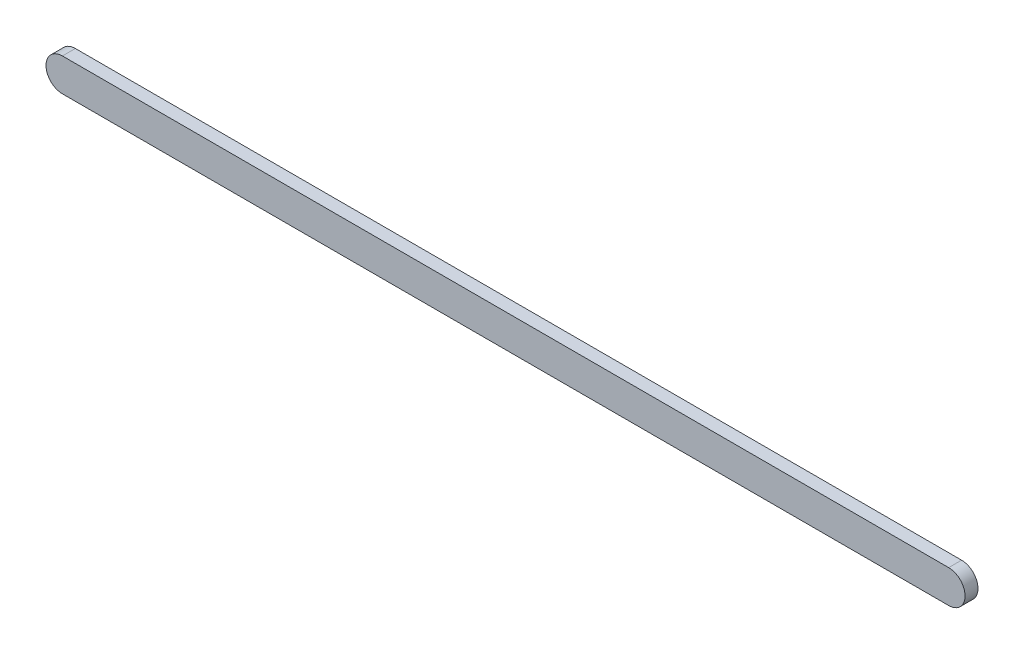
ISO-10303-21;
HEADER;
FILE_DESCRIPTION(('STEP AP214'),'2;1');
FILE_NAME('part.step','',(''),(''),'','','');
FILE_SCHEMA(('AUTOMOTIVE_DESIGN { 1 0 10303 214 1 1 1 1 }'));
ENDSEC;
DATA;
#1=APPLICATION_CONTEXT('core data for automotive mechanical design processes');
#2=APPLICATION_PROTOCOL_DEFINITION('international standard','automotive_design',2000,#1);
#3=PRODUCT_CONTEXT('',#1,'mechanical');
#4=PRODUCT('Part','Part','',(#3));
#5=PRODUCT_RELATED_PRODUCT_CATEGORY('part','',(#4));
#6=PRODUCT_DEFINITION_FORMATION('','',#4);
#7=PRODUCT_DEFINITION_CONTEXT('part definition',#1,'design');
#8=PRODUCT_DEFINITION('design','',#6,#7);
#9=PRODUCT_DEFINITION_SHAPE('','',#8);
#10=(LENGTH_UNIT() NAMED_UNIT(*) SI_UNIT(.MILLI.,.METRE.));
#11=(NAMED_UNIT(*) PLANE_ANGLE_UNIT() SI_UNIT($,.RADIAN.));
#12=(NAMED_UNIT(*) SI_UNIT($,.STERADIAN.) SOLID_ANGLE_UNIT());
#13=UNCERTAINTY_MEASURE_WITH_UNIT(LENGTH_MEASURE(1.E-05),#10,'distance_accuracy_value','');
#14=(GEOMETRIC_REPRESENTATION_CONTEXT(3) GLOBAL_UNCERTAINTY_ASSIGNED_CONTEXT((#13)) GLOBAL_UNIT_ASSIGNED_CONTEXT((#10,
#11,#12)) REPRESENTATION_CONTEXT('',''));
#15=CARTESIAN_POINT('',(0.,0.,0.));
#16=DIRECTION('',(0.,0.,1.));
#17=DIRECTION('',(1.,0.,0.));
#18=AXIS2_PLACEMENT_3D('',#15,#16,#17);
#19=CARTESIAN_POINT('',(91.567,116.332,0.));
#20=DIRECTION('',(0.,1.,0.));
#21=DIRECTION('',(1.,0.,0.));
#22=AXIS2_PLACEMENT_3D('',#19,#20,#21);
#23=PLANE('',#22);
#24=DIRECTION('',(1.,0.,0.));
#25=VECTOR('',#24,1.);
#26=CARTESIAN_POINT('',(91.567,116.332,0.1999996));
#27=LINE('',#26,#25);
#28=CARTESIAN_POINT('',(91.567,116.332,0.1999996));
#29=VERTEX_POINT('',#28);
#30=CARTESIAN_POINT('',(105.283,116.332,0.1999996));
#31=VERTEX_POINT('',#30);
#32=EDGE_CURVE('E11',#29,#31,#27,.T.);
#33=ORIENTED_EDGE('',*,*,#32,.F.);
#34=DIRECTION('',(0.,0.,1.));
#35=VECTOR('',#34,1.);
#36=CARTESIAN_POINT('',(91.567,116.332,0.));
#37=LINE('',#36,#35);
#38=CARTESIAN_POINT('',(91.567,116.332,0.));
#39=VERTEX_POINT('',#38);
#40=EDGE_CURVE('E24',#39,#29,#37,.T.);
#41=ORIENTED_EDGE('',*,*,#40,.F.);
#42=DIRECTION('',(1.,0.,0.));
#43=VECTOR('',#42,1.);
#44=CARTESIAN_POINT('',(91.567,116.332,0.));
#45=LINE('',#44,#43);
#46=CARTESIAN_POINT('',(105.283,116.332,0.));
#47=VERTEX_POINT('',#46);
#48=EDGE_CURVE('E75',#39,#47,#45,.T.);
#49=ORIENTED_EDGE('',*,*,#48,.T.);
#50=DIRECTION('',(0.,0.,1.));
#51=VECTOR('',#50,1.);
#52=CARTESIAN_POINT('',(105.283,116.332,0.));
#53=LINE('',#52,#51);
#54=EDGE_CURVE('E37',#47,#31,#53,.T.);
#55=ORIENTED_EDGE('',*,*,#54,.T.);
#56=EDGE_LOOP('',(#33,#41,#49,#55));
#57=FACE_BOUND('',#56,.T.);
#58=ADVANCED_FACE('F17',(#57),#23,.F.);
#59=CARTESIAN_POINT('',(105.283,116.586,0.));
#60=DIRECTION('',(0.,0.,-1.));
#61=DIRECTION('',(0.,-1.,0.));
#62=AXIS2_PLACEMENT_3D('',#59,#60,#61);
#63=CYLINDRICAL_SURFACE('',#62,0.254000000000005);
#64=CARTESIAN_POINT('',(105.283,116.586,0.1999996));
#65=DIRECTION('',(0.,0.,1.));
#66=DIRECTION('',(0.,-1.,0.));
#67=AXIS2_PLACEMENT_3D('',#64,#65,#66);
#68=CIRCLE('',#67,0.254000000000005);
#69=CARTESIAN_POINT('',(105.283,116.84,0.1999996));
#70=VERTEX_POINT('',#69);
#71=EDGE_CURVE('E83',#31,#70,#68,.T.);
#72=ORIENTED_EDGE('',*,*,#71,.F.);
#73=ORIENTED_EDGE('',*,*,#54,.F.);
#74=CARTESIAN_POINT('',(105.283,116.586,0.));
#75=DIRECTION('',(0.,0.,1.));
#76=DIRECTION('',(0.,-1.,0.));
#77=AXIS2_PLACEMENT_3D('',#74,#75,#76);
#78=CIRCLE('',#77,0.254000000000005);
#79=CARTESIAN_POINT('',(105.283,116.84,0.));
#80=VERTEX_POINT('',#79);
#81=EDGE_CURVE('E81',#47,#80,#78,.T.);
#82=ORIENTED_EDGE('',*,*,#81,.T.);
#83=DIRECTION('',(0.,0.,1.));
#84=VECTOR('',#83,1.);
#85=CARTESIAN_POINT('',(105.283,116.84,0.));
#86=LINE('',#85,#84);
#87=EDGE_CURVE('E67',#80,#70,#86,.T.);
#88=ORIENTED_EDGE('',*,*,#87,.T.);
#89=EDGE_LOOP('',(#72,#73,#82,#88));
#90=FACE_BOUND('',#89,.T.);
#91=ADVANCED_FACE('F89',(#90),#63,.T.);
#92=CARTESIAN_POINT('',(105.283,116.84,0.));
#93=DIRECTION('',(0.,-1.,0.));
#94=DIRECTION('',(-1.,0.,0.));
#95=AXIS2_PLACEMENT_3D('',#92,#93,#94);
#96=PLANE('',#95);
#97=DIRECTION('',(-1.,0.,0.));
#98=VECTOR('',#97,1.);
#99=CARTESIAN_POINT('',(105.283,116.84,0.1999996));
#100=LINE('',#99,#98);
#101=CARTESIAN_POINT('',(91.567,116.84,0.1999996));
#102=VERTEX_POINT('',#101);
#103=EDGE_CURVE('E71',#70,#102,#100,.T.);
#104=ORIENTED_EDGE('',*,*,#103,.F.);
#105=ORIENTED_EDGE('',*,*,#87,.F.);
#106=DIRECTION('',(-1.,0.,0.));
#107=VECTOR('',#106,1.);
#108=CARTESIAN_POINT('',(105.283,116.84,0.));
#109=LINE('',#108,#107);
#110=CARTESIAN_POINT('',(91.567,116.84,0.));
#111=VERTEX_POINT('',#110);
#112=EDGE_CURVE('E63',#80,#111,#109,.T.);
#113=ORIENTED_EDGE('',*,*,#112,.T.);
#114=DIRECTION('',(0.,0.,1.));
#115=VECTOR('',#114,1.);
#116=CARTESIAN_POINT('',(91.567,116.84,0.));
#117=LINE('',#116,#115);
#118=EDGE_CURVE('E53',#111,#102,#117,.T.);
#119=ORIENTED_EDGE('',*,*,#118,.T.);
#120=EDGE_LOOP('',(#104,#105,#113,#119));
#121=FACE_BOUND('',#120,.T.);
#122=ADVANCED_FACE('F66',(#121),#96,.F.);
#123=CARTESIAN_POINT('',(91.567,116.586,0.));
#124=DIRECTION('',(0.,0.,-1.));
#125=DIRECTION('',(0.,1.,0.));
#126=AXIS2_PLACEMENT_3D('',#123,#124,#125);
#127=CYLINDRICAL_SURFACE('',#126,0.254000000000005);
#128=CARTESIAN_POINT('',(91.567,116.586,0.1999996));
#129=DIRECTION('',(0.,0.,1.));
#130=DIRECTION('',(0.,1.,0.));
#131=AXIS2_PLACEMENT_3D('',#128,#129,#130);
#132=CIRCLE('',#131,0.254000000000005);
#133=EDGE_CURVE('E59',#102,#29,#132,.T.);
#134=ORIENTED_EDGE('',*,*,#133,.F.);
#135=ORIENTED_EDGE('',*,*,#118,.F.);
#136=CARTESIAN_POINT('',(91.567,116.586,0.));
#137=DIRECTION('',(0.,0.,1.));
#138=DIRECTION('',(0.,1.,0.));
#139=AXIS2_PLACEMENT_3D('',#136,#137,#138);
#140=CIRCLE('',#139,0.254000000000005);
#141=EDGE_CURVE('E57',#111,#39,#140,.T.);
#142=ORIENTED_EDGE('',*,*,#141,.T.);
#143=ORIENTED_EDGE('',*,*,#40,.T.);
#144=EDGE_LOOP('',(#134,#135,#142,#143));
#145=FACE_BOUND('',#144,.T.);
#146=ADVANCED_FACE('F55',(#145),#127,.T.);
#147=CARTESIAN_POINT('',(91.567,116.332,0.));
#148=DIRECTION('',(0.,0.,-1.));
#149=DIRECTION('',(-1.,0.,0.));
#150=AXIS2_PLACEMENT_3D('',#147,#148,#149);
#151=PLANE('',#150);
#152=ORIENTED_EDGE('',*,*,#141,.F.);
#153=ORIENTED_EDGE('',*,*,#112,.F.);
#154=ORIENTED_EDGE('',*,*,#81,.F.);
#155=ORIENTED_EDGE('',*,*,#48,.F.);
#156=EDGE_LOOP('',(#152,#153,#154,#155));
#157=FACE_BOUND('',#156,.T.);
#158=ADVANCED_FACE('F74',(#157),#151,.T.);
#159=CARTESIAN_POINT('',(91.567,116.332,0.1999996));
#160=DIRECTION('',(0.,0.,-1.));
#161=DIRECTION('',(-1.,0.,0.));
#162=AXIS2_PLACEMENT_3D('',#159,#160,#161);
#163=PLANE('',#162);
#164=ORIENTED_EDGE('',*,*,#32,.T.);
#165=ORIENTED_EDGE('',*,*,#71,.T.);
#166=ORIENTED_EDGE('',*,*,#103,.T.);
#167=ORIENTED_EDGE('',*,*,#133,.T.);
#168=EDGE_LOOP('',(#164,#165,#166,#167));
#169=FACE_BOUND('',#168,.T.);
#170=ADVANCED_FACE('F91',(#169),#163,.F.);
#171=CLOSED_SHELL('',(#58,#91,#122,#146,#158,#170));
#172=MANIFOLD_SOLID_BREP('B1',#171);
#173=ADVANCED_BREP_SHAPE_REPRESENTATION('',(#18,#172),#14);
#174=SHAPE_DEFINITION_REPRESENTATION(#9,#173);
ENDSEC;
END-ISO-10303-21;
